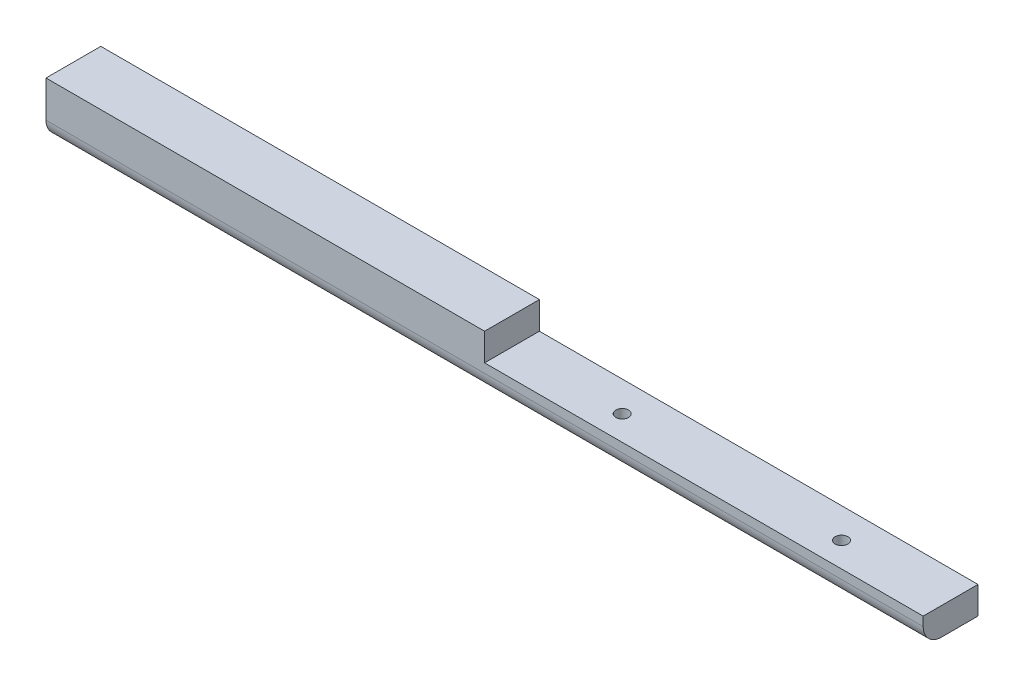
ISO-10303-21;
HEADER;
FILE_DESCRIPTION(('STEP AP214'),'2;1');
FILE_NAME('part.step','',(''),(''),'','','');
FILE_SCHEMA(('AUTOMOTIVE_DESIGN { 1 0 10303 214 1 1 1 1 }'));
ENDSEC;
DATA;
#1=APPLICATION_CONTEXT('core data for automotive mechanical design processes');
#2=APPLICATION_PROTOCOL_DEFINITION('international standard','automotive_design',2000,#1);
#3=PRODUCT_CONTEXT('',#1,'mechanical');
#4=PRODUCT('Part','Part','',(#3));
#5=PRODUCT_RELATED_PRODUCT_CATEGORY('part','',(#4));
#6=PRODUCT_DEFINITION_FORMATION('','',#4);
#7=PRODUCT_DEFINITION_CONTEXT('part definition',#1,'design');
#8=PRODUCT_DEFINITION('design','',#6,#7);
#9=PRODUCT_DEFINITION_SHAPE('','',#8);
#10=(LENGTH_UNIT() NAMED_UNIT(*) SI_UNIT(.MILLI.,.METRE.));
#11=(NAMED_UNIT(*) PLANE_ANGLE_UNIT() SI_UNIT($,.RADIAN.));
#12=(NAMED_UNIT(*) SI_UNIT($,.STERADIAN.) SOLID_ANGLE_UNIT());
#13=UNCERTAINTY_MEASURE_WITH_UNIT(LENGTH_MEASURE(1.E-05),#10,'distance_accuracy_value','');
#14=(GEOMETRIC_REPRESENTATION_CONTEXT(3) GLOBAL_UNCERTAINTY_ASSIGNED_CONTEXT((#13)) GLOBAL_UNIT_ASSIGNED_CONTEXT((#10,
#11,#12)) REPRESENTATION_CONTEXT('',''));
#15=CARTESIAN_POINT('',(0.,0.,0.));
#16=DIRECTION('',(0.,0.,1.));
#17=DIRECTION('',(1.,0.,0.));
#18=AXIS2_PLACEMENT_3D('',#15,#16,#17);
#19=CARTESIAN_POINT('',(195.886266753297,-328.191488077078,30.6295855642618));
#20=DIRECTION('',(0.,1.,0.));
#21=DIRECTION('',(0.,0.,1.));
#22=AXIS2_PLACEMENT_3D('',#19,#20,#21);
#23=CYLINDRICAL_SURFACE('',#22,1.75000000000001);
#24=CARTESIAN_POINT('',(195.886266753297,-320.691488077077,30.6295855642618));
#25=DIRECTION('',(0.,-1.,0.));
#26=DIRECTION('',(0.,0.,-1.));
#27=AXIS2_PLACEMENT_3D('',#24,#25,#26);
#28=CIRCLE('',#27,1.75000000000001);
#29=CARTESIAN_POINT('',(195.886266753297,-320.691488077077,28.8795855642618));
#30=VERTEX_POINT('',#29);
#31=EDGE_CURVE('E310',#30,#30,#28,.T.);
#32=ORIENTED_EDGE('',*,*,#31,.F.);
#33=EDGE_LOOP('',(#32));
#34=FACE_BOUND('',#33,.T.);
#35=CARTESIAN_POINT('',(195.886266753297,-325.191488077077,30.6295855642618));
#36=DIRECTION('',(0.,-1.,0.));
#37=DIRECTION('',(0.,0.,-1.));
#38=AXIS2_PLACEMENT_3D('',#35,#36,#37);
#39=CIRCLE('',#38,1.75000000000001);
#40=CARTESIAN_POINT('',(195.886266753297,-325.191488077077,28.8795855642618));
#41=VERTEX_POINT('',#40);
#42=EDGE_CURVE('E296',#41,#41,#39,.F.);
#43=ORIENTED_EDGE('',*,*,#42,.F.);
#44=EDGE_LOOP('',(#43));
#45=FACE_BOUND('',#44,.T.);
#46=ADVANCED_FACE('F39',(#34,#45),#23,.F.);
#47=CARTESIAN_POINT('',(135.886266753297,-328.191488077078,30.6295855642618));
#48=DIRECTION('',(0.,1.,0.));
#49=DIRECTION('',(0.,0.,1.));
#50=AXIS2_PLACEMENT_3D('',#47,#48,#49);
#51=CYLINDRICAL_SURFACE('',#50,1.75000000000001);
#52=CARTESIAN_POINT('',(135.886266753297,-320.691488077077,30.6295855642618));
#53=DIRECTION('',(0.,-1.,0.));
#54=DIRECTION('',(0.,0.,-1.));
#55=AXIS2_PLACEMENT_3D('',#52,#53,#54);
#56=CIRCLE('',#55,1.75000000000001);
#57=CARTESIAN_POINT('',(135.886266753297,-320.691488077077,28.8795855642618));
#58=VERTEX_POINT('',#57);
#59=EDGE_CURVE('E381',#58,#58,#56,.T.);
#60=ORIENTED_EDGE('',*,*,#59,.F.);
#61=EDGE_LOOP('',(#60));
#62=FACE_BOUND('',#61,.T.);
#63=CARTESIAN_POINT('',(135.886266753297,-325.191488077077,30.6295855642618));
#64=DIRECTION('',(0.,-1.,0.));
#65=DIRECTION('',(0.,0.,-1.));
#66=AXIS2_PLACEMENT_3D('',#63,#64,#65);
#67=CIRCLE('',#66,1.75000000000001);
#68=CARTESIAN_POINT('',(135.886266753297,-325.191488077077,28.8795855642618));
#69=VERTEX_POINT('',#68);
#70=EDGE_CURVE('E364',#69,#69,#67,.F.);
#71=ORIENTED_EDGE('',*,*,#70,.F.);
#72=EDGE_LOOP('',(#71));
#73=FACE_BOUND('',#72,.T.);
#74=ADVANCED_FACE('F617',(#62,#73),#51,.F.);
#75=CARTESIAN_POINT('',(225.,-320.691488077077,22.39));
#76=DIRECTION('',(-1.,0.,0.));
#77=DIRECTION('',(0.,0.,1.));
#78=AXIS2_PLACEMENT_3D('',#75,#76,#77);
#79=PLANE('',#78);
#80=DIRECTION('',(0.,0.,1.));
#81=VECTOR('',#80,1.);
#82=CARTESIAN_POINT('',(225.,-320.691488077077,22.39));
#83=LINE('',#82,#81);
#84=CARTESIAN_POINT('',(225.,-320.691488077077,22.4));
#85=VERTEX_POINT('',#84);
#86=CARTESIAN_POINT('',(225.,-320.691488077077,37.4));
#87=VERTEX_POINT('',#86);
#88=EDGE_CURVE('E537',#85,#87,#83,.T.);
#89=ORIENTED_EDGE('',*,*,#88,.T.);
#90=DIRECTION('',(0.,1.,0.));
#91=VECTOR('',#90,1.);
#92=CARTESIAN_POINT('',(225.,-313.191488077077,37.4));
#93=LINE('',#92,#91);
#94=CARTESIAN_POINT('',(225.,-323.191488077077,37.4));
#95=VERTEX_POINT('',#94);
#96=EDGE_CURVE('E528',#95,#87,#93,.T.);
#97=ORIENTED_EDGE('',*,*,#96,.F.);
#98=CARTESIAN_POINT('',(225.,-323.191488077077,32.4));
#99=DIRECTION('',(-1.,0.,0.));
#100=DIRECTION('',(0.,0.,1.));
#101=AXIS2_PLACEMENT_3D('',#98,#99,#100);
#102=CIRCLE('',#101,5.);
#103=CARTESIAN_POINT('',(225.,-328.191488077077,32.4));
#104=VERTEX_POINT('',#103);
#105=EDGE_CURVE('E510',#95,#104,#102,.F.);
#106=ORIENTED_EDGE('',*,*,#105,.T.);
#107=DIRECTION('',(0.,0.,1.));
#108=VECTOR('',#107,1.);
#109=CARTESIAN_POINT('',(225.,-328.191488077078,22.4));
#110=LINE('',#109,#108);
#111=CARTESIAN_POINT('',(225.,-328.191488077078,22.4));
#112=VERTEX_POINT('',#111);
#113=EDGE_CURVE('E515',#112,#104,#110,.T.);
#114=ORIENTED_EDGE('',*,*,#113,.F.);
#115=DIRECTION('',(0.,-1.,0.));
#116=VECTOR('',#115,1.);
#117=CARTESIAN_POINT('',(225.,-313.191488077077,22.4));
#118=LINE('',#117,#116);
#119=EDGE_CURVE('E509',#85,#112,#118,.T.);
#120=ORIENTED_EDGE('',*,*,#119,.F.);
#121=EDGE_LOOP('',(#89,#97,#106,#114,#120));
#122=FACE_BOUND('',#121,.T.);
#123=ADVANCED_FACE('F596',(#122),#79,.F.);
#124=CARTESIAN_POINT('',(105.,-320.691488077077,22.39));
#125=DIRECTION('',(0.,-1.,0.));
#126=DIRECTION('',(0.,0.,-1.));
#127=AXIS2_PLACEMENT_3D('',#124,#125,#126);
#128=PLANE('',#127);
#129=ORIENTED_EDGE('',*,*,#31,.T.);
#130=EDGE_LOOP('',(#129));
#131=FACE_BOUND('',#130,.T.);
#132=ORIENTED_EDGE('',*,*,#59,.T.);
#133=EDGE_LOOP('',(#132));
#134=FACE_BOUND('',#133,.T.);
#135=DIRECTION('',(0.,0.,1.));
#136=VECTOR('',#135,1.);
#137=CARTESIAN_POINT('',(105.,-320.691488077077,22.39));
#138=LINE('',#137,#136);
#139=CARTESIAN_POINT('',(105.,-320.691488077077,22.4));
#140=VERTEX_POINT('',#139);
#141=CARTESIAN_POINT('',(105.,-320.691488077077,37.4));
#142=VERTEX_POINT('',#141);
#143=EDGE_CURVE('E514',#140,#142,#138,.T.);
#144=ORIENTED_EDGE('',*,*,#143,.T.);
#145=DIRECTION('',(-1.,0.,0.));
#146=VECTOR('',#145,1.);
#147=CARTESIAN_POINT('',(366.213203435596,-320.691488077077,37.4));
#148=LINE('',#147,#146);
#149=EDGE_CURVE('E531',#87,#142,#148,.T.);
#150=ORIENTED_EDGE('',*,*,#149,.F.);
#151=ORIENTED_EDGE('',*,*,#88,.F.);
#152=DIRECTION('',(1.,0.,0.));
#153=VECTOR('',#152,1.);
#154=CARTESIAN_POINT('',(366.213203435596,-320.691488077077,22.4));
#155=LINE('',#154,#153);
#156=EDGE_CURVE('E516',#140,#85,#155,.T.);
#157=ORIENTED_EDGE('',*,*,#156,.F.);
#158=EDGE_LOOP('',(#144,#150,#151,#157));
#159=FACE_BOUND('',#158,.T.);
#160=ADVANCED_FACE('F609',(#131,#134,#159),#128,.F.);
#161=CARTESIAN_POINT('',(105.,-313.191488077077,22.39));
#162=DIRECTION('',(-1.,0.,0.));
#163=DIRECTION('',(0.,-1.,0.));
#164=AXIS2_PLACEMENT_3D('',#161,#162,#163);
#165=PLANE('',#164);
#166=DIRECTION('',(0.,0.,-1.));
#167=VECTOR('',#166,1.);
#168=CARTESIAN_POINT('',(105.,-313.191488077077,22.4));
#169=LINE('',#168,#167);
#170=CARTESIAN_POINT('',(105.,-313.191488077077,37.4));
#171=VERTEX_POINT('',#170);
#172=CARTESIAN_POINT('',(105.,-313.191488077077,22.4));
#173=VERTEX_POINT('',#172);
#174=EDGE_CURVE('E524',#171,#173,#169,.T.);
#175=ORIENTED_EDGE('',*,*,#174,.F.);
#176=DIRECTION('',(0.,1.,0.));
#177=VECTOR('',#176,1.);
#178=CARTESIAN_POINT('',(105.,-313.191488077078,37.4));
#179=LINE('',#178,#177);
#180=EDGE_CURVE('E534',#142,#171,#179,.T.);
#181=ORIENTED_EDGE('',*,*,#180,.F.);
#182=ORIENTED_EDGE('',*,*,#143,.F.);
#183=DIRECTION('',(0.,-1.,0.));
#184=VECTOR('',#183,1.);
#185=CARTESIAN_POINT('',(105.,-313.191488077078,22.4));
#186=LINE('',#185,#184);
#187=EDGE_CURVE('E520',#173,#140,#186,.T.);
#188=ORIENTED_EDGE('',*,*,#187,.F.);
#189=EDGE_LOOP('',(#175,#181,#182,#188));
#190=FACE_BOUND('',#189,.T.);
#191=ADVANCED_FACE('F41',(#190),#165,.F.);
#192=CARTESIAN_POINT('',(-15.,0.,0.));
#193=DIRECTION('',(-1.,0.,0.));
#194=DIRECTION('',(0.,0.,1.));
#195=AXIS2_PLACEMENT_3D('',#192,#193,#194);
#196=PLANE('',#195);
#197=DIRECTION('',(0.,1.,0.));
#198=VECTOR('',#197,1.);
#199=CARTESIAN_POINT('',(-15.,-324.191488077077,34.4));
#200=LINE('',#199,#198);
#201=CARTESIAN_POINT('',(-15.,-324.191488077077,34.4));
#202=VERTEX_POINT('',#201);
#203=CARTESIAN_POINT('',(-15.,-317.191488077077,34.4));
#204=VERTEX_POINT('',#203);
#205=EDGE_CURVE('E391',#202,#204,#200,.T.);
#206=ORIENTED_EDGE('',*,*,#205,.F.);
#207=CARTESIAN_POINT('',(-15.,-324.191488077077,33.4));
#208=DIRECTION('',(-1.,0.,0.));
#209=DIRECTION('',(0.,0.,1.));
#210=AXIS2_PLACEMENT_3D('',#207,#208,#209);
#211=CIRCLE('',#210,1.);
#212=CARTESIAN_POINT('',(-15.,-325.191488077077,33.4));
#213=VERTEX_POINT('',#212);
#214=EDGE_CURVE('E442',#213,#202,#211,.T.);
#215=ORIENTED_EDGE('',*,*,#214,.F.);
#216=DIRECTION('',(0.,0.,1.));
#217=VECTOR('',#216,1.);
#218=CARTESIAN_POINT('',(-15.,-325.191488077077,32.4));
#219=LINE('',#218,#217);
#220=CARTESIAN_POINT('',(-15.,-325.191488077078,26.4));
#221=VERTEX_POINT('',#220);
#222=EDGE_CURVE('E438',#221,#213,#219,.T.);
#223=ORIENTED_EDGE('',*,*,#222,.F.);
#224=CARTESIAN_POINT('',(-15.,-324.191488077078,26.4));
#225=DIRECTION('',(-1.,0.,0.));
#226=DIRECTION('',(0.,0.,1.));
#227=AXIS2_PLACEMENT_3D('',#224,#225,#226);
#228=CIRCLE('',#227,1.);
#229=CARTESIAN_POINT('',(-15.,-324.191488077078,25.4));
#230=VERTEX_POINT('',#229);
#231=EDGE_CURVE('E434',#230,#221,#228,.T.);
#232=ORIENTED_EDGE('',*,*,#231,.F.);
#233=DIRECTION('',(0.,-1.,0.));
#234=VECTOR('',#233,1.);
#235=CARTESIAN_POINT('',(-15.,-317.191488077077,25.4));
#236=LINE('',#235,#234);
#237=CARTESIAN_POINT('',(-15.,-317.191488077077,25.4));
#238=VERTEX_POINT('',#237);
#239=EDGE_CURVE('E430',#238,#230,#236,.T.);
#240=ORIENTED_EDGE('',*,*,#239,.F.);
#241=CARTESIAN_POINT('',(-15.,-317.191488077077,26.4));
#242=DIRECTION('',(-1.,0.,0.));
#243=DIRECTION('',(0.,0.,1.));
#244=AXIS2_PLACEMENT_3D('',#241,#242,#243);
#245=CIRCLE('',#244,1.);
#246=CARTESIAN_POINT('',(-15.,-316.191488077077,26.4));
#247=VERTEX_POINT('',#246);
#248=EDGE_CURVE('E426',#247,#238,#245,.T.);
#249=ORIENTED_EDGE('',*,*,#248,.F.);
#250=DIRECTION('',(0.,0.,-1.));
#251=VECTOR('',#250,1.);
#252=CARTESIAN_POINT('',(-15.,-316.191488077077,33.4));
#253=LINE('',#252,#251);
#254=CARTESIAN_POINT('',(-15.,-316.191488077077,33.4));
#255=VERTEX_POINT('',#254);
#256=EDGE_CURVE('E422',#255,#247,#253,.T.);
#257=ORIENTED_EDGE('',*,*,#256,.F.);
#258=CARTESIAN_POINT('',(-15.,-317.191488077077,33.4));
#259=DIRECTION('',(-1.,0.,0.));
#260=DIRECTION('',(0.,0.,1.));
#261=AXIS2_PLACEMENT_3D('',#258,#259,#260);
#262=CIRCLE('',#261,1.);
#263=EDGE_CURVE('E385',#204,#255,#262,.T.);
#264=ORIENTED_EDGE('',*,*,#263,.F.);
#265=EDGE_LOOP('',(#206,#215,#223,#232,#240,#249,#257,#264));
#266=FACE_BOUND('',#265,.T.);
#267=DIRECTION('',(0.,0.,-1.));
#268=VECTOR('',#267,1.);
#269=CARTESIAN_POINT('',(-15.,-328.191488077078,22.4));
#270=LINE('',#269,#268);
#271=CARTESIAN_POINT('',(-15.,-328.191488077077,32.4));
#272=VERTEX_POINT('',#271);
#273=CARTESIAN_POINT('',(-15.,-328.191488077078,22.4));
#274=VERTEX_POINT('',#273);
#275=EDGE_CURVE('E484',#272,#274,#270,.T.);
#276=ORIENTED_EDGE('',*,*,#275,.F.);
#277=CARTESIAN_POINT('',(-15.,-323.191488077077,32.4));
#278=DIRECTION('',(-1.,0.,0.));
#279=DIRECTION('',(0.,0.,1.));
#280=AXIS2_PLACEMENT_3D('',#277,#278,#279);
#281=CIRCLE('',#280,5.);
#282=CARTESIAN_POINT('',(-15.,-323.191488077077,37.4));
#283=VERTEX_POINT('',#282);
#284=EDGE_CURVE('E502',#272,#283,#281,.T.);
#285=ORIENTED_EDGE('',*,*,#284,.T.);
#286=DIRECTION('',(0.,-1.,0.));
#287=VECTOR('',#286,1.);
#288=CARTESIAN_POINT('',(-15.,-313.191488077077,37.4));
#289=LINE('',#288,#287);
#290=CARTESIAN_POINT('',(-15.,-313.191488077077,37.4));
#291=VERTEX_POINT('',#290);
#292=EDGE_CURVE('E480',#291,#283,#289,.T.);
#293=ORIENTED_EDGE('',*,*,#292,.F.);
#294=DIRECTION('',(0.,0.,1.));
#295=VECTOR('',#294,1.);
#296=CARTESIAN_POINT('',(-15.,-313.191488077077,22.4));
#297=LINE('',#296,#295);
#298=CARTESIAN_POINT('',(-15.,-313.191488077077,22.4));
#299=VERTEX_POINT('',#298);
#300=EDGE_CURVE('E476',#299,#291,#297,.T.);
#301=ORIENTED_EDGE('',*,*,#300,.F.);
#302=DIRECTION('',(0.,1.,0.));
#303=VECTOR('',#302,1.);
#304=CARTESIAN_POINT('',(-15.,-313.191488077077,22.4));
#305=LINE('',#304,#303);
#306=EDGE_CURVE('E452',#274,#299,#305,.T.);
#307=ORIENTED_EDGE('',*,*,#306,.F.);
#308=EDGE_LOOP('',(#276,#285,#293,#301,#307));
#309=FACE_BOUND('',#308,.T.);
#310=ADVANCED_FACE('F588',(#266,#309),#196,.T.);
#311=CARTESIAN_POINT('',(366.213203435596,-328.191488077078,22.4));
#312=DIRECTION('',(0.,1.,0.));
#313=DIRECTION('',(0.,0.,1.));
#314=AXIS2_PLACEMENT_3D('',#311,#312,#313);
#315=PLANE('',#314);
#316=DIRECTION('',(0.,0.,-1.));
#317=VECTOR('',#316,1.);
#318=CARTESIAN_POINT('',(192.886266753297,-328.191488077077,32.3616363718307));
#319=LINE('',#318,#317);
#320=CARTESIAN_POINT('',(192.886266753297,-328.191488077077,32.3616363718307));
#321=VERTEX_POINT('',#320);
#322=CARTESIAN_POINT('',(192.886266753297,-328.191488077077,28.897534756693));
#323=VERTEX_POINT('',#322);
#324=EDGE_CURVE('E261',#321,#323,#319,.T.);
#325=ORIENTED_EDGE('',*,*,#324,.F.);
#326=DIRECTION('',(-0.866025403784439,0.,-0.5));
#327=VECTOR('',#326,1.);
#328=CARTESIAN_POINT('',(195.886266753297,-328.191488077077,34.0936871793996));
#329=LINE('',#328,#327);
#330=CARTESIAN_POINT('',(192.952714506449,-328.191488077077,32.4));
#331=VERTEX_POINT('',#330);
#332=EDGE_CURVE('E266',#331,#321,#329,.T.);
#333=ORIENTED_EDGE('',*,*,#332,.F.);
#334=DIRECTION('',(-1.,0.,0.));
#335=VECTOR('',#334,1.);
#336=CARTESIAN_POINT('',(366.213203435596,-328.191488077077,32.4));
#337=LINE('',#336,#335);
#338=CARTESIAN_POINT('',(138.819819000145,-328.191488077077,32.4));
#339=VERTEX_POINT('',#338);
#340=EDGE_CURVE('E63',#331,#339,#337,.T.);
#341=ORIENTED_EDGE('',*,*,#340,.T.);
#342=DIRECTION('',(-0.866025403784439,0.,0.5));
#343=VECTOR('',#342,1.);
#344=CARTESIAN_POINT('',(138.886266753297,-328.191488077077,32.3616363718307));
#345=LINE('',#344,#343);
#346=CARTESIAN_POINT('',(138.886266753297,-328.191488077077,32.3616363718307));
#347=VERTEX_POINT('',#346);
#348=EDGE_CURVE('E352',#347,#339,#345,.T.);
#349=ORIENTED_EDGE('',*,*,#348,.F.);
#350=DIRECTION('',(0.,0.,1.));
#351=VECTOR('',#350,1.);
#352=CARTESIAN_POINT('',(138.886266753297,-328.191488077077,28.897534756693));
#353=LINE('',#352,#351);
#354=CARTESIAN_POINT('',(138.886266753297,-328.191488077077,28.897534756693));
#355=VERTEX_POINT('',#354);
#356=EDGE_CURVE('E348',#355,#347,#353,.T.);
#357=ORIENTED_EDGE('',*,*,#356,.F.);
#358=DIRECTION('',(0.866025403784439,0.,0.499999999999999));
#359=VECTOR('',#358,1.);
#360=CARTESIAN_POINT('',(135.886266753297,-328.191488077077,27.1654839491241));
#361=LINE('',#360,#359);
#362=CARTESIAN_POINT('',(135.886266753297,-328.191488077077,27.1654839491241));
#363=VERTEX_POINT('',#362);
#364=EDGE_CURVE('E344',#363,#355,#361,.T.);
#365=ORIENTED_EDGE('',*,*,#364,.F.);
#366=DIRECTION('',(0.866025403784438,0.,-0.500000000000002));
#367=VECTOR('',#366,1.);
#368=CARTESIAN_POINT('',(132.886266753297,-328.191488077077,28.897534756693));
#369=LINE('',#368,#367);
#370=CARTESIAN_POINT('',(132.886266753297,-328.191488077077,28.897534756693));
#371=VERTEX_POINT('',#370);
#372=EDGE_CURVE('E314',#371,#363,#369,.T.);
#373=ORIENTED_EDGE('',*,*,#372,.F.);
#374=DIRECTION('',(0.,0.,-1.));
#375=VECTOR('',#374,1.);
#376=CARTESIAN_POINT('',(132.886266753297,-328.191488077077,32.3616363718307));
#377=LINE('',#376,#375);
#378=CARTESIAN_POINT('',(132.886266753297,-328.191488077077,32.3616363718307));
#379=VERTEX_POINT('',#378);
#380=EDGE_CURVE('E320',#379,#371,#377,.T.);
#381=ORIENTED_EDGE('',*,*,#380,.F.);
#382=DIRECTION('',(-0.866025403784439,0.,-0.5));
#383=VECTOR('',#382,1.);
#384=CARTESIAN_POINT('',(135.886266753297,-328.191488077077,34.0936871793996));
#385=LINE('',#384,#383);
#386=CARTESIAN_POINT('',(132.952714506449,-328.191488077077,32.4));
#387=VERTEX_POINT('',#386);
#388=EDGE_CURVE('E355',#387,#379,#385,.T.);
#389=ORIENTED_EDGE('',*,*,#388,.F.);
#390=EDGE_CURVE('E497',#387,#272,#337,.T.);
#391=ORIENTED_EDGE('',*,*,#390,.T.);
#392=ORIENTED_EDGE('',*,*,#275,.T.);
#393=DIRECTION('',(-1.,0.,0.));
#394=VECTOR('',#393,1.);
#395=CARTESIAN_POINT('',(366.213203435596,-328.191488077078,22.4));
#396=LINE('',#395,#394);
#397=EDGE_CURVE('E488',#112,#274,#396,.T.);
#398=ORIENTED_EDGE('',*,*,#397,.F.);
#399=ORIENTED_EDGE('',*,*,#113,.T.);
#400=CARTESIAN_POINT('',(198.819819000145,-328.191488077077,32.4));
#401=VERTEX_POINT('',#400);
#402=EDGE_CURVE('E498',#104,#401,#337,.T.);
#403=ORIENTED_EDGE('',*,*,#402,.T.);
#404=DIRECTION('',(-0.866025403784439,0.,0.5));
#405=VECTOR('',#404,1.);
#406=CARTESIAN_POINT('',(198.886266753297,-328.191488077077,32.3616363718307));
#407=LINE('',#406,#405);
#408=CARTESIAN_POINT('',(198.886266753297,-328.191488077077,32.3616363718307));
#409=VERTEX_POINT('',#408);
#410=EDGE_CURVE('E55',#409,#401,#407,.T.);
#411=ORIENTED_EDGE('',*,*,#410,.F.);
#412=DIRECTION('',(0.,0.,1.));
#413=VECTOR('',#412,1.);
#414=CARTESIAN_POINT('',(198.886266753297,-328.191488077077,28.897534756693));
#415=LINE('',#414,#413);
#416=CARTESIAN_POINT('',(198.886266753297,-328.191488077077,28.897534756693));
#417=VERTEX_POINT('',#416);
#418=EDGE_CURVE('E285',#417,#409,#415,.T.);
#419=ORIENTED_EDGE('',*,*,#418,.F.);
#420=DIRECTION('',(0.866025403784439,0.,0.499999999999999));
#421=VECTOR('',#420,1.);
#422=CARTESIAN_POINT('',(195.886266753297,-328.191488077077,27.1654839491241));
#423=LINE('',#422,#421);
#424=CARTESIAN_POINT('',(195.886266753297,-328.191488077077,27.1654839491241));
#425=VERTEX_POINT('',#424);
#426=EDGE_CURVE('E282',#425,#417,#423,.T.);
#427=ORIENTED_EDGE('',*,*,#426,.F.);
#428=DIRECTION('',(0.866025403784438,0.,-0.500000000000002));
#429=VECTOR('',#428,1.);
#430=CARTESIAN_POINT('',(192.886266753297,-328.191488077077,28.897534756693));
#431=LINE('',#430,#429);
#432=EDGE_CURVE('E239',#323,#425,#431,.T.);
#433=ORIENTED_EDGE('',*,*,#432,.F.);
#434=EDGE_LOOP('',(#325,#333,#341,#349,#357,#365,#373,#381,#389,#391,#392,#398,#399,#403,#411,
#419,#427,#433));
#435=FACE_BOUND('',#434,.T.);
#436=ADVANCED_FACE('F580',(#435),#315,.F.);
#437=CARTESIAN_POINT('',(366.213203435596,-313.191488077077,37.4));
#438=DIRECTION('',(0.,0.,-1.));
#439=DIRECTION('',(0.,1.,0.));
#440=AXIS2_PLACEMENT_3D('',#437,#438,#439);
#441=PLANE('',#440);
#442=ORIENTED_EDGE('',*,*,#149,.T.);
#443=ORIENTED_EDGE('',*,*,#180,.T.);
#444=DIRECTION('',(-1.,0.,0.));
#445=VECTOR('',#444,1.);
#446=CARTESIAN_POINT('',(366.213203435596,-313.191488077077,37.4));
#447=LINE('',#446,#445);
#448=EDGE_CURVE('E491',#171,#291,#447,.T.);
#449=ORIENTED_EDGE('',*,*,#448,.T.);
#450=ORIENTED_EDGE('',*,*,#292,.T.);
#451=DIRECTION('',(-1.,0.,0.));
#452=VECTOR('',#451,1.);
#453=CARTESIAN_POINT('',(366.213203435596,-323.191488077077,37.4));
#454=LINE('',#453,#452);
#455=EDGE_CURVE('E505',#283,#95,#454,.F.);
#456=ORIENTED_EDGE('',*,*,#455,.T.);
#457=ORIENTED_EDGE('',*,*,#96,.T.);
#458=EDGE_LOOP('',(#442,#443,#449,#450,#456,#457));
#459=FACE_BOUND('',#458,.T.);
#460=ADVANCED_FACE('F600',(#459),#441,.F.);
#461=CARTESIAN_POINT('',(366.213203435596,-313.191488077077,22.4));
#462=DIRECTION('',(0.,-1.,0.));
#463=DIRECTION('',(0.,0.,-1.));
#464=AXIS2_PLACEMENT_3D('',#461,#462,#463);
#465=PLANE('',#464);
#466=ORIENTED_EDGE('',*,*,#448,.F.);
#467=ORIENTED_EDGE('',*,*,#174,.T.);
#468=DIRECTION('',(-1.,0.,0.));
#469=VECTOR('',#468,1.);
#470=CARTESIAN_POINT('',(366.213203435596,-313.191488077077,22.4));
#471=LINE('',#470,#469);
#472=EDGE_CURVE('E494',#173,#299,#471,.T.);
#473=ORIENTED_EDGE('',*,*,#472,.T.);
#474=ORIENTED_EDGE('',*,*,#300,.T.);
#475=EDGE_LOOP('',(#466,#467,#473,#474));
#476=FACE_BOUND('',#475,.T.);
#477=ADVANCED_FACE('F605',(#476),#465,.F.);
#478=CARTESIAN_POINT('',(366.213203435596,-313.191488077077,22.4));
#479=DIRECTION('',(0.,0.,1.));
#480=DIRECTION('',(0.,-1.,0.));
#481=AXIS2_PLACEMENT_3D('',#478,#479,#480);
#482=PLANE('',#481);
#483=ORIENTED_EDGE('',*,*,#472,.F.);
#484=ORIENTED_EDGE('',*,*,#187,.T.);
#485=ORIENTED_EDGE('',*,*,#156,.T.);
#486=ORIENTED_EDGE('',*,*,#119,.T.);
#487=ORIENTED_EDGE('',*,*,#397,.T.);
#488=ORIENTED_EDGE('',*,*,#306,.T.);
#489=EDGE_LOOP('',(#483,#484,#485,#486,#487,#488));
#490=FACE_BOUND('',#489,.T.);
#491=ADVANCED_FACE('F592',(#490),#482,.F.);
#492=CARTESIAN_POINT('',(366.213203435596,-323.191488077077,32.4));
#493=DIRECTION('',(-1.,0.,0.));
#494=DIRECTION('',(0.,0.,1.));
#495=AXIS2_PLACEMENT_3D('',#492,#493,#494);
#496=CYLINDRICAL_SURFACE('',#495,5.);
#497=CARTESIAN_POINT('',(192.952714506449,-323.191488077077,32.4));
#498=DIRECTION('',(-0.5,0.,0.866025403784439));
#499=DIRECTION('',(-0.866025403784439,0.,-0.5));
#500=AXIS2_PLACEMENT_3D('',#497,#498,#499);
#501=ELLIPSE('',#500,10.,5.);
#502=CARTESIAN_POINT('',(195.886266753297,-327.895892793759,34.0936871793996));
#503=VERTEX_POINT('',#502);
#504=EDGE_CURVE('E11',#503,#331,#501,.F.);
#505=ORIENTED_EDGE('',*,*,#504,.F.);
#506=CARTESIAN_POINT('',(198.819819000145,-323.191488077077,32.4));
#507=DIRECTION('',(0.5,0.,0.866025403784439));
#508=DIRECTION('',(-0.866025403784439,0.,0.5));
#509=AXIS2_PLACEMENT_3D('',#506,#507,#508);
#510=ELLIPSE('',#509,10.,5.);
#511=EDGE_CURVE('E48',#401,#503,#510,.F.);
#512=ORIENTED_EDGE('',*,*,#511,.F.);
#513=ORIENTED_EDGE('',*,*,#402,.F.);
#514=ORIENTED_EDGE('',*,*,#105,.F.);
#515=ORIENTED_EDGE('',*,*,#455,.F.);
#516=ORIENTED_EDGE('',*,*,#284,.F.);
#517=ORIENTED_EDGE('',*,*,#390,.F.);
#518=CARTESIAN_POINT('',(132.952714506449,-323.191488077077,32.4));
#519=DIRECTION('',(-0.5,0.,0.866025403784439));
#520=DIRECTION('',(-0.866025403784439,0.,-0.5));
#521=AXIS2_PLACEMENT_3D('',#518,#519,#520);
#522=ELLIPSE('',#521,10.,5.);
#523=CARTESIAN_POINT('',(135.886266753297,-327.895892793759,34.0936871793996));
#524=VERTEX_POINT('',#523);
#525=EDGE_CURVE('E554',#524,#387,#522,.F.);
#526=ORIENTED_EDGE('',*,*,#525,.F.);
#527=CARTESIAN_POINT('',(138.819819000145,-323.191488077077,32.4));
#528=DIRECTION('',(0.5,0.,0.866025403784439));
#529=DIRECTION('',(-0.866025403784439,0.,0.5));
#530=AXIS2_PLACEMENT_3D('',#527,#528,#529);
#531=ELLIPSE('',#530,10.,5.);
#532=EDGE_CURVE('E541',#339,#524,#531,.F.);
#533=ORIENTED_EDGE('',*,*,#532,.F.);
#534=ORIENTED_EDGE('',*,*,#340,.F.);
#535=EDGE_LOOP('',(#505,#512,#513,#514,#515,#516,#517,#526,#533,#534));
#536=FACE_BOUND('',#535,.T.);
#537=ADVANCED_FACE('F569',(#536),#496,.T.);
#538=CARTESIAN_POINT('',(-5.00000000000001,-324.191488077077,34.4));
#539=DIRECTION('',(0.,0.,1.));
#540=DIRECTION('',(1.,0.,0.));
#541=AXIS2_PLACEMENT_3D('',#538,#539,#540);
#542=PLANE('',#541);
#543=ORIENTED_EDGE('',*,*,#205,.T.);
#544=DIRECTION('',(-1.,0.,0.));
#545=VECTOR('',#544,1.);
#546=CARTESIAN_POINT('',(-5.00000000000001,-317.191488077077,34.4));
#547=LINE('',#546,#545);
#548=CARTESIAN_POINT('',(-5.00000000000001,-317.191488077077,34.4));
#549=VERTEX_POINT('',#548);
#550=EDGE_CURVE('E418',#549,#204,#547,.T.);
#551=ORIENTED_EDGE('',*,*,#550,.F.);
#552=DIRECTION('',(0.,1.,0.));
#553=VECTOR('',#552,1.);
#554=CARTESIAN_POINT('',(-5.00000000000001,-323.191488077077,34.4));
#555=LINE('',#554,#553);
#556=CARTESIAN_POINT('',(-5.00000000000001,-324.191488077077,34.4));
#557=VERTEX_POINT('',#556);
#558=EDGE_CURVE('E386',#557,#549,#555,.T.);
#559=ORIENTED_EDGE('',*,*,#558,.F.);
#560=DIRECTION('',(-1.,0.,0.));
#561=VECTOR('',#560,1.);
#562=CARTESIAN_POINT('',(-5.00000000000001,-324.191488077077,34.4));
#563=LINE('',#562,#561);
#564=EDGE_CURVE('E449',#557,#202,#563,.T.);
#565=ORIENTED_EDGE('',*,*,#564,.T.);
#566=EDGE_LOOP('',(#543,#551,#559,#565));
#567=FACE_BOUND('',#566,.T.);
#568=ADVANCED_FACE('F665',(#567),#542,.F.);
#569=CARTESIAN_POINT('',(-5.00000000000001,-324.191488077077,33.4));
#570=DIRECTION('',(-1.,0.,0.));
#571=DIRECTION('',(0.,0.,1.));
#572=AXIS2_PLACEMENT_3D('',#569,#570,#571);
#573=CYLINDRICAL_SURFACE('',#572,1.);
#574=ORIENTED_EDGE('',*,*,#214,.T.);
#575=ORIENTED_EDGE('',*,*,#564,.F.);
#576=CARTESIAN_POINT('',(-5.00000000000001,-324.191488077077,33.4));
#577=DIRECTION('',(-1.,0.,0.));
#578=DIRECTION('',(0.,0.,1.));
#579=AXIS2_PLACEMENT_3D('',#576,#577,#578);
#580=CIRCLE('',#579,1.);
#581=CARTESIAN_POINT('',(-5.00000000000001,-325.191488077077,33.4));
#582=VERTEX_POINT('',#581);
#583=EDGE_CURVE('E414',#582,#557,#580,.T.);
#584=ORIENTED_EDGE('',*,*,#583,.F.);
#585=DIRECTION('',(-1.,0.,0.));
#586=VECTOR('',#585,1.);
#587=CARTESIAN_POINT('',(-5.00000000000001,-325.191488077077,33.4));
#588=LINE('',#587,#586);
#589=EDGE_CURVE('E453',#582,#213,#588,.T.);
#590=ORIENTED_EDGE('',*,*,#589,.T.);
#591=EDGE_LOOP('',(#574,#575,#584,#590));
#592=FACE_BOUND('',#591,.T.);
#593=ADVANCED_FACE('F668',(#592),#573,.F.);
#594=CARTESIAN_POINT('',(-5.00000000000001,-325.191488077077,32.4));
#595=DIRECTION('',(0.,-1.,0.));
#596=DIRECTION('',(0.,0.,-1.));
#597=AXIS2_PLACEMENT_3D('',#594,#595,#596);
#598=PLANE('',#597);
#599=ORIENTED_EDGE('',*,*,#222,.T.);
#600=ORIENTED_EDGE('',*,*,#589,.F.);
#601=DIRECTION('',(0.,0.,1.));
#602=VECTOR('',#601,1.);
#603=CARTESIAN_POINT('',(-5.00000000000001,-325.191488077078,26.4));
#604=LINE('',#603,#602);
#605=CARTESIAN_POINT('',(-5.00000000000001,-325.191488077078,26.4));
#606=VERTEX_POINT('',#605);
#607=EDGE_CURVE('E411',#606,#582,#604,.T.);
#608=ORIENTED_EDGE('',*,*,#607,.F.);
#609=DIRECTION('',(-1.,0.,0.));
#610=VECTOR('',#609,1.);
#611=CARTESIAN_POINT('',(-5.00000000000001,-325.191488077078,26.4));
#612=LINE('',#611,#610);
#613=EDGE_CURVE('E456',#606,#221,#612,.T.);
#614=ORIENTED_EDGE('',*,*,#613,.T.);
#615=EDGE_LOOP('',(#599,#600,#608,#614));
#616=FACE_BOUND('',#615,.T.);
#617=ADVANCED_FACE('F672',(#616),#598,.F.);
#618=CARTESIAN_POINT('',(-5.00000000000001,-324.191488077078,26.4));
#619=DIRECTION('',(-1.,0.,0.));
#620=DIRECTION('',(0.,0.,1.));
#621=AXIS2_PLACEMENT_3D('',#618,#619,#620);
#622=CYLINDRICAL_SURFACE('',#621,1.);
#623=ORIENTED_EDGE('',*,*,#231,.T.);
#624=ORIENTED_EDGE('',*,*,#613,.F.);
#625=CARTESIAN_POINT('',(-5.00000000000001,-324.191488077078,26.4));
#626=DIRECTION('',(-1.,0.,0.));
#627=DIRECTION('',(0.,0.,1.));
#628=AXIS2_PLACEMENT_3D('',#625,#626,#627);
#629=CIRCLE('',#628,1.);
#630=CARTESIAN_POINT('',(-5.00000000000001,-324.191488077078,25.4));
#631=VERTEX_POINT('',#630);
#632=EDGE_CURVE('E407',#631,#606,#629,.T.);
#633=ORIENTED_EDGE('',*,*,#632,.F.);
#634=DIRECTION('',(-1.,0.,0.));
#635=VECTOR('',#634,1.);
#636=CARTESIAN_POINT('',(-5.00000000000001,-324.191488077078,25.4));
#637=LINE('',#636,#635);
#638=EDGE_CURVE('E459',#631,#230,#637,.T.);
#639=ORIENTED_EDGE('',*,*,#638,.T.);
#640=EDGE_LOOP('',(#623,#624,#633,#639));
#641=FACE_BOUND('',#640,.T.);
#642=ADVANCED_FACE('F676',(#641),#622,.F.);
#643=CARTESIAN_POINT('',(-5.00000000000001,-317.191488077077,25.4));
#644=DIRECTION('',(0.,0.,-1.));
#645=DIRECTION('',(0.,1.,0.));
#646=AXIS2_PLACEMENT_3D('',#643,#644,#645);
#647=PLANE('',#646);
#648=ORIENTED_EDGE('',*,*,#239,.T.);
#649=ORIENTED_EDGE('',*,*,#638,.F.);
#650=DIRECTION('',(0.,-1.,0.));
#651=VECTOR('',#650,1.);
#652=CARTESIAN_POINT('',(-5.00000000000001,-317.191488077077,25.4));
#653=LINE('',#652,#651);
#654=CARTESIAN_POINT('',(-5.00000000000001,-317.191488077077,25.4));
#655=VERTEX_POINT('',#654);
#656=EDGE_CURVE('E403',#655,#631,#653,.T.);
#657=ORIENTED_EDGE('',*,*,#656,.F.);
#658=DIRECTION('',(-1.,0.,0.));
#659=VECTOR('',#658,1.);
#660=CARTESIAN_POINT('',(-5.00000000000001,-317.191488077077,25.4));
#661=LINE('',#660,#659);
#662=EDGE_CURVE('E462',#655,#238,#661,.T.);
#663=ORIENTED_EDGE('',*,*,#662,.T.);
#664=EDGE_LOOP('',(#648,#649,#657,#663));
#665=FACE_BOUND('',#664,.T.);
#666=ADVANCED_FACE('F680',(#665),#647,.F.);
#667=CARTESIAN_POINT('',(-5.00000000000001,-317.191488077077,26.4));
#668=DIRECTION('',(-1.,0.,0.));
#669=DIRECTION('',(0.,0.,1.));
#670=AXIS2_PLACEMENT_3D('',#667,#668,#669);
#671=CYLINDRICAL_SURFACE('',#670,1.);
#672=ORIENTED_EDGE('',*,*,#248,.T.);
#673=ORIENTED_EDGE('',*,*,#662,.F.);
#674=CARTESIAN_POINT('',(-5.00000000000001,-317.191488077077,26.4));
#675=DIRECTION('',(-1.,0.,0.));
#676=DIRECTION('',(0.,0.,1.));
#677=AXIS2_PLACEMENT_3D('',#674,#675,#676);
#678=CIRCLE('',#677,1.);
#679=CARTESIAN_POINT('',(-5.00000000000001,-316.191488077077,26.4));
#680=VERTEX_POINT('',#679);
#681=EDGE_CURVE('E399',#680,#655,#678,.T.);
#682=ORIENTED_EDGE('',*,*,#681,.F.);
#683=DIRECTION('',(-1.,0.,0.));
#684=VECTOR('',#683,1.);
#685=CARTESIAN_POINT('',(-5.00000000000001,-316.191488077077,26.4));
#686=LINE('',#685,#684);
#687=EDGE_CURVE('E465',#680,#247,#686,.T.);
#688=ORIENTED_EDGE('',*,*,#687,.T.);
#689=EDGE_LOOP('',(#672,#673,#682,#688));
#690=FACE_BOUND('',#689,.T.);
#691=ADVANCED_FACE('F684',(#690),#671,.F.);
#692=CARTESIAN_POINT('',(-5.00000000000001,-316.191488077077,33.4));
#693=DIRECTION('',(0.,1.,0.));
#694=DIRECTION('',(0.,0.,1.));
#695=AXIS2_PLACEMENT_3D('',#692,#693,#694);
#696=PLANE('',#695);
#697=ORIENTED_EDGE('',*,*,#256,.T.);
#698=ORIENTED_EDGE('',*,*,#687,.F.);
#699=DIRECTION('',(0.,0.,-1.));
#700=VECTOR('',#699,1.);
#701=CARTESIAN_POINT('',(-5.00000000000001,-316.191488077077,33.4));
#702=LINE('',#701,#700);
#703=CARTESIAN_POINT('',(-5.00000000000001,-316.191488077077,33.4));
#704=VERTEX_POINT('',#703);
#705=EDGE_CURVE('E395',#704,#680,#702,.T.);
#706=ORIENTED_EDGE('',*,*,#705,.F.);
#707=DIRECTION('',(-1.,0.,0.));
#708=VECTOR('',#707,1.);
#709=CARTESIAN_POINT('',(-5.00000000000001,-316.191488077077,33.4));
#710=LINE('',#709,#708);
#711=EDGE_CURVE('E468',#704,#255,#710,.T.);
#712=ORIENTED_EDGE('',*,*,#711,.T.);
#713=EDGE_LOOP('',(#697,#698,#706,#712));
#714=FACE_BOUND('',#713,.T.);
#715=ADVANCED_FACE('F688',(#714),#696,.F.);
#716=CARTESIAN_POINT('',(-5.00000000000001,-317.191488077077,33.4));
#717=DIRECTION('',(-1.,0.,0.));
#718=DIRECTION('',(0.,0.,1.));
#719=AXIS2_PLACEMENT_3D('',#716,#717,#718);
#720=CYLINDRICAL_SURFACE('',#719,1.);
#721=ORIENTED_EDGE('',*,*,#263,.T.);
#722=ORIENTED_EDGE('',*,*,#711,.F.);
#723=CARTESIAN_POINT('',(-5.00000000000001,-317.191488077077,33.4));
#724=DIRECTION('',(-1.,0.,0.));
#725=DIRECTION('',(0.,0.,1.));
#726=AXIS2_PLACEMENT_3D('',#723,#724,#725);
#727=CIRCLE('',#726,1.);
#728=EDGE_CURVE('E390',#549,#704,#727,.T.);
#729=ORIENTED_EDGE('',*,*,#728,.F.);
#730=ORIENTED_EDGE('',*,*,#550,.T.);
#731=EDGE_LOOP('',(#721,#722,#729,#730));
#732=FACE_BOUND('',#731,.T.);
#733=ADVANCED_FACE('F663',(#732),#720,.F.);
#734=CARTESIAN_POINT('',(-5.00000000000001,-317.191488077077,33.4));
#735=DIRECTION('',(-1.,0.,0.));
#736=DIRECTION('',(0.,0.,1.));
#737=AXIS2_PLACEMENT_3D('',#734,#735,#736);
#738=PLANE('',#737);
#739=ORIENTED_EDGE('',*,*,#558,.T.);
#740=ORIENTED_EDGE('',*,*,#728,.T.);
#741=ORIENTED_EDGE('',*,*,#705,.T.);
#742=ORIENTED_EDGE('',*,*,#681,.T.);
#743=ORIENTED_EDGE('',*,*,#656,.T.);
#744=ORIENTED_EDGE('',*,*,#632,.T.);
#745=ORIENTED_EDGE('',*,*,#607,.T.);
#746=ORIENTED_EDGE('',*,*,#583,.T.);
#747=EDGE_LOOP('',(#739,#740,#741,#742,#743,#744,#745,#746));
#748=FACE_BOUND('',#747,.T.);
#749=ADVANCED_FACE('F616',(#748),#738,.T.);
#750=CARTESIAN_POINT('',(0.,-325.191488077077,0.));
#751=DIRECTION('',(0.,-1.,0.));
#752=DIRECTION('',(0.,0.,-1.));
#753=AXIS2_PLACEMENT_3D('',#750,#751,#752);
#754=PLANE('',#753);
#755=DIRECTION('',(0.866025403784438,0.,-0.500000000000002));
#756=VECTOR('',#755,1.);
#757=CARTESIAN_POINT('',(132.886266753297,-325.191488077077,28.897534756693));
#758=LINE('',#757,#756);
#759=CARTESIAN_POINT('',(132.886266753297,-325.191488077077,28.897534756693));
#760=VERTEX_POINT('',#759);
#761=CARTESIAN_POINT('',(135.886266753297,-325.191488077077,27.1654839491241));
#762=VERTEX_POINT('',#761);
#763=EDGE_CURVE('E315',#760,#762,#758,.T.);
#764=ORIENTED_EDGE('',*,*,#763,.T.);
#765=DIRECTION('',(0.866025403784439,0.,0.499999999999999));
#766=VECTOR('',#765,1.);
#767=CARTESIAN_POINT('',(135.886266753297,-325.191488077077,27.1654839491241));
#768=LINE('',#767,#766);
#769=CARTESIAN_POINT('',(138.886266753297,-325.191488077077,28.897534756693));
#770=VERTEX_POINT('',#769);
#771=EDGE_CURVE('E319',#762,#770,#768,.T.);
#772=ORIENTED_EDGE('',*,*,#771,.T.);
#773=DIRECTION('',(0.,0.,1.));
#774=VECTOR('',#773,1.);
#775=CARTESIAN_POINT('',(138.886266753297,-325.191488077077,28.897534756693));
#776=LINE('',#775,#774);
#777=CARTESIAN_POINT('',(138.886266753297,-325.191488077077,32.3616363718307));
#778=VERTEX_POINT('',#777);
#779=EDGE_CURVE('E324',#770,#778,#776,.T.);
#780=ORIENTED_EDGE('',*,*,#779,.T.);
#781=DIRECTION('',(-0.866025403784439,0.,0.5));
#782=VECTOR('',#781,1.);
#783=CARTESIAN_POINT('',(138.886266753297,-325.191488077077,32.3616363718307));
#784=LINE('',#783,#782);
#785=CARTESIAN_POINT('',(135.886266753297,-325.191488077077,34.0936871793996));
#786=VERTEX_POINT('',#785);
#787=EDGE_CURVE('E328',#778,#786,#784,.T.);
#788=ORIENTED_EDGE('',*,*,#787,.T.);
#789=DIRECTION('',(-0.866025403784439,0.,-0.5));
#790=VECTOR('',#789,1.);
#791=CARTESIAN_POINT('',(135.886266753297,-325.191488077077,34.0936871793996));
#792=LINE('',#791,#790);
#793=CARTESIAN_POINT('',(132.886266753297,-325.191488077077,32.3616363718307));
#794=VERTEX_POINT('',#793);
#795=EDGE_CURVE('E332',#786,#794,#792,.T.);
#796=ORIENTED_EDGE('',*,*,#795,.T.);
#797=DIRECTION('',(0.,0.,-1.));
#798=VECTOR('',#797,1.);
#799=CARTESIAN_POINT('',(132.886266753297,-325.191488077077,32.3616363718307));
#800=LINE('',#799,#798);
#801=EDGE_CURVE('E336',#794,#760,#800,.T.);
#802=ORIENTED_EDGE('',*,*,#801,.T.);
#803=EDGE_LOOP('',(#764,#772,#780,#788,#796,#802));
#804=FACE_BOUND('',#803,.T.);
#805=ORIENTED_EDGE('',*,*,#70,.T.);
#806=EDGE_LOOP('',(#805));
#807=FACE_BOUND('',#806,.T.);
#808=ADVANCED_FACE('F633',(#804,#807),#754,.T.);
#809=CARTESIAN_POINT('',(132.886266753297,-325.191488077077,28.897534756693));
#810=DIRECTION('',(-0.500000000000002,0.,-0.866025403784437));
#811=DIRECTION('',(-0.866025403784438,0.,0.500000000000002));
#812=AXIS2_PLACEMENT_3D('',#809,#810,#811);
#813=PLANE('',#812);
#814=ORIENTED_EDGE('',*,*,#372,.T.);
#815=DIRECTION('',(0.,-1.,0.));
#816=VECTOR('',#815,1.);
#817=CARTESIAN_POINT('',(135.886266753297,-325.191488077077,27.1654839491241));
#818=LINE('',#817,#816);
#819=EDGE_CURVE('E340',#762,#363,#818,.T.);
#820=ORIENTED_EDGE('',*,*,#819,.F.);
#821=ORIENTED_EDGE('',*,*,#763,.F.);
#822=DIRECTION('',(0.,-1.,0.));
#823=VECTOR('',#822,1.);
#824=CARTESIAN_POINT('',(132.886266753297,-325.191488077077,28.897534756693));
#825=LINE('',#824,#823);
#826=EDGE_CURVE('E361',#760,#371,#825,.T.);
#827=ORIENTED_EDGE('',*,*,#826,.T.);
#828=EDGE_LOOP('',(#814,#820,#821,#827));
#829=FACE_BOUND('',#828,.T.);
#830=ADVANCED_FACE('F636',(#829),#813,.F.);
#831=CARTESIAN_POINT('',(132.886266753297,-325.191488077077,32.3616363718307));
#832=DIRECTION('',(-1.,0.,0.));
#833=DIRECTION('',(0.,0.,1.));
#834=AXIS2_PLACEMENT_3D('',#831,#832,#833);
#835=PLANE('',#834);
#836=ORIENTED_EDGE('',*,*,#380,.T.);
#837=ORIENTED_EDGE('',*,*,#826,.F.);
#838=ORIENTED_EDGE('',*,*,#801,.F.);
#839=DIRECTION('',(0.,-1.,0.));
#840=VECTOR('',#839,1.);
#841=CARTESIAN_POINT('',(132.886266753297,-325.191488077077,32.3616363718307));
#842=LINE('',#841,#840);
#843=EDGE_CURVE('E365',#794,#379,#842,.T.);
#844=ORIENTED_EDGE('',*,*,#843,.T.);
#845=EDGE_LOOP('',(#836,#837,#838,#844));
#846=FACE_BOUND('',#845,.T.);
#847=ADVANCED_FACE('F638',(#846),#835,.F.);
#848=CARTESIAN_POINT('',(135.886266753297,-325.191488077077,34.0936871793996));
#849=DIRECTION('',(-0.5,0.,0.866025403784439));
#850=DIRECTION('',(0.866025403784439,0.,0.5));
#851=AXIS2_PLACEMENT_3D('',#848,#849,#850);
#852=PLANE('',#851);
#853=ORIENTED_EDGE('',*,*,#525,.T.);
#854=ORIENTED_EDGE('',*,*,#388,.T.);
#855=ORIENTED_EDGE('',*,*,#843,.F.);
#856=ORIENTED_EDGE('',*,*,#795,.F.);
#857=DIRECTION('',(0.,-1.,0.));
#858=VECTOR('',#857,1.);
#859=CARTESIAN_POINT('',(135.886266753297,-325.191488077077,34.0936871793996));
#860=LINE('',#859,#858);
#861=EDGE_CURVE('E369',#786,#524,#860,.T.);
#862=ORIENTED_EDGE('',*,*,#861,.T.);
#863=EDGE_LOOP('',(#853,#854,#855,#856,#862));
#864=FACE_BOUND('',#863,.T.);
#865=ADVANCED_FACE('F641',(#864),#852,.F.);
#866=CARTESIAN_POINT('',(138.886266753297,-325.191488077077,32.3616363718307));
#867=DIRECTION('',(0.5,0.,0.866025403784439));
#868=DIRECTION('',(0.866025403784439,0.,-0.5));
#869=AXIS2_PLACEMENT_3D('',#866,#867,#868);
#870=PLANE('',#869);
#871=ORIENTED_EDGE('',*,*,#532,.T.);
#872=ORIENTED_EDGE('',*,*,#861,.F.);
#873=ORIENTED_EDGE('',*,*,#787,.F.);
#874=DIRECTION('',(0.,-1.,0.));
#875=VECTOR('',#874,1.);
#876=CARTESIAN_POINT('',(138.886266753297,-325.191488077077,32.3616363718307));
#877=LINE('',#876,#875);
#878=EDGE_CURVE('E373',#778,#347,#877,.T.);
#879=ORIENTED_EDGE('',*,*,#878,.T.);
#880=ORIENTED_EDGE('',*,*,#348,.T.);
#881=EDGE_LOOP('',(#871,#872,#873,#879,#880));
#882=FACE_BOUND('',#881,.T.);
#883=ADVANCED_FACE('F645',(#882),#870,.F.);
#884=CARTESIAN_POINT('',(138.886266753297,-325.191488077077,28.897534756693));
#885=DIRECTION('',(1.,0.,0.));
#886=DIRECTION('',(0.,0.,-1.));
#887=AXIS2_PLACEMENT_3D('',#884,#885,#886);
#888=PLANE('',#887);
#889=ORIENTED_EDGE('',*,*,#356,.T.);
#890=ORIENTED_EDGE('',*,*,#878,.F.);
#891=ORIENTED_EDGE('',*,*,#779,.F.);
#892=DIRECTION('',(0.,-1.,0.));
#893=VECTOR('',#892,1.);
#894=CARTESIAN_POINT('',(138.886266753297,-325.191488077077,28.897534756693));
#895=LINE('',#894,#893);
#896=EDGE_CURVE('E376',#770,#355,#895,.T.);
#897=ORIENTED_EDGE('',*,*,#896,.T.);
#898=EDGE_LOOP('',(#889,#890,#891,#897));
#899=FACE_BOUND('',#898,.T.);
#900=ADVANCED_FACE('F649',(#899),#888,.F.);
#901=CARTESIAN_POINT('',(135.886266753297,-325.191488077077,27.1654839491241));
#902=DIRECTION('',(0.499999999999999,0.,-0.866025403784439));
#903=DIRECTION('',(-0.866025403784439,0.,-0.499999999999999));
#904=AXIS2_PLACEMENT_3D('',#901,#902,#903);
#905=PLANE('',#904);
#906=ORIENTED_EDGE('',*,*,#364,.T.);
#907=ORIENTED_EDGE('',*,*,#896,.F.);
#908=ORIENTED_EDGE('',*,*,#771,.F.);
#909=ORIENTED_EDGE('',*,*,#819,.T.);
#910=EDGE_LOOP('',(#906,#907,#908,#909));
#911=FACE_BOUND('',#910,.T.);
#912=ADVANCED_FACE('F653',(#911),#905,.F.);
#913=CARTESIAN_POINT('',(60.,-325.191488077077,0.));
#914=DIRECTION('',(0.,-1.,0.));
#915=DIRECTION('',(0.,0.,-1.));
#916=AXIS2_PLACEMENT_3D('',#913,#914,#915);
#917=PLANE('',#916);
#918=DIRECTION('',(0.866025403784438,0.,-0.500000000000002));
#919=VECTOR('',#918,1.);
#920=CARTESIAN_POINT('',(192.886266753297,-325.191488077077,28.897534756693));
#921=LINE('',#920,#919);
#922=CARTESIAN_POINT('',(192.886266753297,-325.191488077077,28.897534756693));
#923=VERTEX_POINT('',#922);
#924=CARTESIAN_POINT('',(195.886266753297,-325.191488077077,27.1654839491241));
#925=VERTEX_POINT('',#924);
#926=EDGE_CURVE('E236',#923,#925,#921,.T.);
#927=ORIENTED_EDGE('',*,*,#926,.T.);
#928=DIRECTION('',(0.866025403784439,0.,0.499999999999999));
#929=VECTOR('',#928,1.);
#930=CARTESIAN_POINT('',(195.886266753297,-325.191488077077,27.1654839491241));
#931=LINE('',#930,#929);
#932=CARTESIAN_POINT('',(198.886266753297,-325.191488077077,28.897534756693));
#933=VERTEX_POINT('',#932);
#934=EDGE_CURVE('E248',#925,#933,#931,.T.);
#935=ORIENTED_EDGE('',*,*,#934,.T.);
#936=DIRECTION('',(0.,0.,1.));
#937=VECTOR('',#936,1.);
#938=CARTESIAN_POINT('',(198.886266753297,-325.191488077077,28.897534756693));
#939=LINE('',#938,#937);
#940=CARTESIAN_POINT('',(198.886266753297,-325.191488077077,32.3616363718307));
#941=VERTEX_POINT('',#940);
#942=EDGE_CURVE('E254',#933,#941,#939,.T.);
#943=ORIENTED_EDGE('',*,*,#942,.T.);
#944=DIRECTION('',(-0.866025403784439,0.,0.5));
#945=VECTOR('',#944,1.);
#946=CARTESIAN_POINT('',(198.886266753297,-325.191488077077,32.3616363718307));
#947=LINE('',#946,#945);
#948=CARTESIAN_POINT('',(195.886266753297,-325.191488077077,34.0936871793996));
#949=VERTEX_POINT('',#948);
#950=EDGE_CURVE('E271',#941,#949,#947,.T.);
#951=ORIENTED_EDGE('',*,*,#950,.T.);
#952=DIRECTION('',(-0.866025403784439,0.,-0.5));
#953=VECTOR('',#952,1.);
#954=CARTESIAN_POINT('',(195.886266753297,-325.191488077077,34.0936871793996));
#955=LINE('',#954,#953);
#956=CARTESIAN_POINT('',(192.886266753297,-325.191488077077,32.3616363718307));
#957=VERTEX_POINT('',#956);
#958=EDGE_CURVE('E275',#949,#957,#955,.T.);
#959=ORIENTED_EDGE('',*,*,#958,.T.);
#960=DIRECTION('',(0.,0.,-1.));
#961=VECTOR('',#960,1.);
#962=CARTESIAN_POINT('',(192.886266753297,-325.191488077077,32.3616363718307));
#963=LINE('',#962,#961);
#964=EDGE_CURVE('E245',#957,#923,#963,.T.);
#965=ORIENTED_EDGE('',*,*,#964,.T.);
#966=EDGE_LOOP('',(#927,#935,#943,#951,#959,#965));
#967=FACE_BOUND('',#966,.T.);
#968=ORIENTED_EDGE('',*,*,#42,.T.);
#969=EDGE_LOOP('',(#968));
#970=FACE_BOUND('',#969,.T.);
#971=ADVANCED_FACE('F256',(#967,#970),#917,.T.);
#972=CARTESIAN_POINT('',(192.886266753297,-325.191488077077,28.897534756693));
#973=DIRECTION('',(-0.500000000000002,0.,-0.866025403784437));
#974=DIRECTION('',(-0.866025403784438,0.,0.500000000000002));
#975=AXIS2_PLACEMENT_3D('',#972,#973,#974);
#976=PLANE('',#975);
#977=ORIENTED_EDGE('',*,*,#432,.T.);
#978=DIRECTION('',(0.,-1.,0.));
#979=VECTOR('',#978,1.);
#980=CARTESIAN_POINT('',(195.886266753297,-325.191488077077,27.1654839491241));
#981=LINE('',#980,#979);
#982=EDGE_CURVE('E232',#925,#425,#981,.T.);
#983=ORIENTED_EDGE('',*,*,#982,.F.);
#984=ORIENTED_EDGE('',*,*,#926,.F.);
#985=DIRECTION('',(0.,-1.,0.));
#986=VECTOR('',#985,1.);
#987=CARTESIAN_POINT('',(192.886266753297,-325.191488077077,28.897534756693));
#988=LINE('',#987,#986);
#989=EDGE_CURVE('E293',#923,#323,#988,.T.);
#990=ORIENTED_EDGE('',*,*,#989,.T.);
#991=EDGE_LOOP('',(#977,#983,#984,#990));
#992=FACE_BOUND('',#991,.T.);
#993=ADVANCED_FACE('F234',(#992),#976,.F.);
#994=CARTESIAN_POINT('',(192.886266753297,-325.191488077077,32.3616363718307));
#995=DIRECTION('',(-1.,0.,0.));
#996=DIRECTION('',(0.,0.,1.));
#997=AXIS2_PLACEMENT_3D('',#994,#995,#996);
#998=PLANE('',#997);
#999=ORIENTED_EDGE('',*,*,#324,.T.);
#1000=ORIENTED_EDGE('',*,*,#989,.F.);
#1001=ORIENTED_EDGE('',*,*,#964,.F.);
#1002=DIRECTION('',(0.,-1.,0.));
#1003=VECTOR('',#1002,1.);
#1004=CARTESIAN_POINT('',(192.886266753297,-325.191488077077,32.3616363718307));
#1005=LINE('',#1004,#1003);
#1006=EDGE_CURVE('E297',#957,#321,#1005,.T.);
#1007=ORIENTED_EDGE('',*,*,#1006,.T.);
#1008=EDGE_LOOP('',(#999,#1000,#1001,#1007));
#1009=FACE_BOUND('',#1008,.T.);
#1010=ADVANCED_FACE('F806',(#1009),#998,.F.);
#1011=CARTESIAN_POINT('',(195.886266753297,-325.191488077077,34.0936871793996));
#1012=DIRECTION('',(-0.5,0.,0.866025403784439));
#1013=DIRECTION('',(0.866025403784439,0.,0.5));
#1014=AXIS2_PLACEMENT_3D('',#1011,#1012,#1013);
#1015=PLANE('',#1014);
#1016=ORIENTED_EDGE('',*,*,#504,.T.);
#1017=ORIENTED_EDGE('',*,*,#332,.T.);
#1018=ORIENTED_EDGE('',*,*,#1006,.F.);
#1019=ORIENTED_EDGE('',*,*,#958,.F.);
#1020=DIRECTION('',(0.,-1.,0.));
#1021=VECTOR('',#1020,1.);
#1022=CARTESIAN_POINT('',(195.886266753297,-325.191488077077,34.0936871793996));
#1023=LINE('',#1022,#1021);
#1024=EDGE_CURVE('E301',#949,#503,#1023,.T.);
#1025=ORIENTED_EDGE('',*,*,#1024,.T.);
#1026=EDGE_LOOP('',(#1016,#1017,#1018,#1019,#1025));
#1027=FACE_BOUND('',#1026,.T.);
#1028=ADVANCED_FACE('F568',(#1027),#1015,.F.);
#1029=CARTESIAN_POINT('',(198.886266753297,-325.191488077077,32.3616363718307));
#1030=DIRECTION('',(0.5,0.,0.866025403784439));
#1031=DIRECTION('',(0.866025403784439,0.,-0.5));
#1032=AXIS2_PLACEMENT_3D('',#1029,#1030,#1031);
#1033=PLANE('',#1032);
#1034=ORIENTED_EDGE('',*,*,#511,.T.);
#1035=ORIENTED_EDGE('',*,*,#1024,.F.);
#1036=ORIENTED_EDGE('',*,*,#950,.F.);
#1037=DIRECTION('',(0.,-1.,0.));
#1038=VECTOR('',#1037,1.);
#1039=CARTESIAN_POINT('',(198.886266753297,-325.191488077077,32.3616363718307));
#1040=LINE('',#1039,#1038);
#1041=EDGE_CURVE('E305',#941,#409,#1040,.T.);
#1042=ORIENTED_EDGE('',*,*,#1041,.T.);
#1043=ORIENTED_EDGE('',*,*,#410,.T.);
#1044=EDGE_LOOP('',(#1034,#1035,#1036,#1042,#1043));
#1045=FACE_BOUND('',#1044,.T.);
#1046=ADVANCED_FACE('F561',(#1045),#1033,.F.);
#1047=CARTESIAN_POINT('',(198.886266753297,-325.191488077077,28.897534756693));
#1048=DIRECTION('',(1.,0.,0.));
#1049=DIRECTION('',(0.,0.,-1.));
#1050=AXIS2_PLACEMENT_3D('',#1047,#1048,#1049);
#1051=PLANE('',#1050);
#1052=ORIENTED_EDGE('',*,*,#418,.T.);
#1053=ORIENTED_EDGE('',*,*,#1041,.F.);
#1054=ORIENTED_EDGE('',*,*,#942,.F.);
#1055=DIRECTION('',(0.,-1.,0.));
#1056=VECTOR('',#1055,1.);
#1057=CARTESIAN_POINT('',(198.886266753297,-325.191488077077,28.897534756693));
#1058=LINE('',#1057,#1056);
#1059=EDGE_CURVE('E244',#933,#417,#1058,.T.);
#1060=ORIENTED_EDGE('',*,*,#1059,.T.);
#1061=EDGE_LOOP('',(#1052,#1053,#1054,#1060));
#1062=FACE_BOUND('',#1061,.T.);
#1063=ADVANCED_FACE('F828',(#1062),#1051,.F.);
#1064=CARTESIAN_POINT('',(195.886266753297,-325.191488077077,27.1654839491241));
#1065=DIRECTION('',(0.499999999999999,0.,-0.866025403784439));
#1066=DIRECTION('',(-0.866025403784439,0.,-0.499999999999999));
#1067=AXIS2_PLACEMENT_3D('',#1064,#1065,#1066);
#1068=PLANE('',#1067);
#1069=ORIENTED_EDGE('',*,*,#426,.T.);
#1070=ORIENTED_EDGE('',*,*,#1059,.F.);
#1071=ORIENTED_EDGE('',*,*,#934,.F.);
#1072=ORIENTED_EDGE('',*,*,#982,.T.);
#1073=EDGE_LOOP('',(#1069,#1070,#1071,#1072));
#1074=FACE_BOUND('',#1073,.T.);
#1075=ADVANCED_FACE('F249',(#1074),#1068,.F.);
#1076=CLOSED_SHELL('',(#46,#74,#123,#160,#191,#310,#436,#460,#477,#491,#537,#568,#593,#617,#642,
#666,#691,#715,#733,#749,#808,#830,#847,#865,#883,#900,#912,#971,#993,#1010,#1028,#1046,#1063,#1075));
#1077=MANIFOLD_SOLID_BREP('B2',#1076);
#1078=ADVANCED_BREP_SHAPE_REPRESENTATION('',(#18,#1077),#14);
#1079=SHAPE_DEFINITION_REPRESENTATION(#9,#1078);
ENDSEC;
END-ISO-10303-21;
